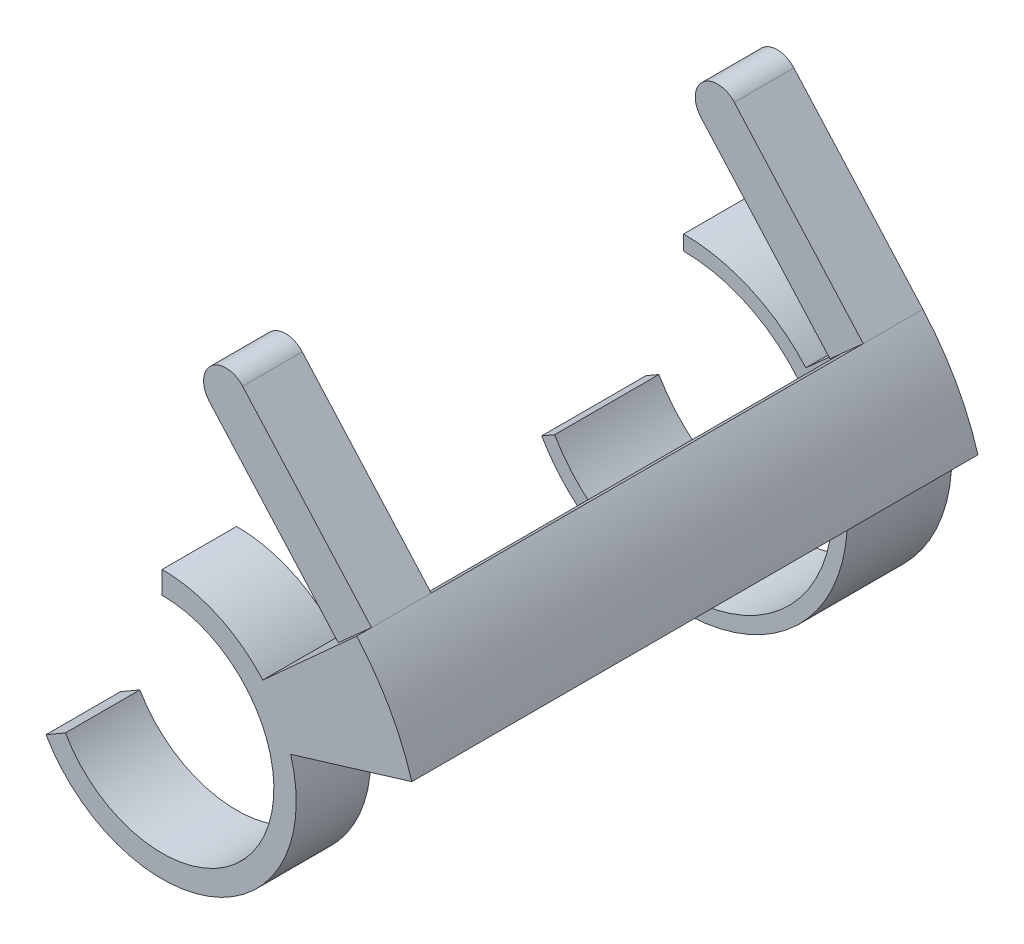
ISO-10303-21;
HEADER;
FILE_DESCRIPTION(('STEP AP214'),'2;1');
FILE_NAME('part.step','',(''),(''),'','','');
FILE_SCHEMA(('AUTOMOTIVE_DESIGN { 1 0 10303 214 1 1 1 1 }'));
ENDSEC;
DATA;
#1=APPLICATION_CONTEXT('core data for automotive mechanical design processes');
#2=APPLICATION_PROTOCOL_DEFINITION('international standard','automotive_design',2000,#1);
#3=PRODUCT_CONTEXT('',#1,'mechanical');
#4=PRODUCT('Part','Part','',(#3));
#5=PRODUCT_RELATED_PRODUCT_CATEGORY('part','',(#4));
#6=PRODUCT_DEFINITION_FORMATION('','',#4);
#7=PRODUCT_DEFINITION_CONTEXT('part definition',#1,'design');
#8=PRODUCT_DEFINITION('design','',#6,#7);
#9=PRODUCT_DEFINITION_SHAPE('','',#8);
#10=(LENGTH_UNIT() NAMED_UNIT(*) SI_UNIT(.MILLI.,.METRE.));
#11=(NAMED_UNIT(*) PLANE_ANGLE_UNIT() SI_UNIT($,.RADIAN.));
#12=(NAMED_UNIT(*) SI_UNIT($,.STERADIAN.) SOLID_ANGLE_UNIT());
#13=UNCERTAINTY_MEASURE_WITH_UNIT(LENGTH_MEASURE(1.E-05),#10,'distance_accuracy_value','');
#14=(GEOMETRIC_REPRESENTATION_CONTEXT(3) GLOBAL_UNCERTAINTY_ASSIGNED_CONTEXT((#13)) GLOBAL_UNIT_ASSIGNED_CONTEXT((#10,
#11,#12)) REPRESENTATION_CONTEXT('',''));
#15=CARTESIAN_POINT('',(0.,0.,0.));
#16=DIRECTION('',(0.,0.,1.));
#17=DIRECTION('',(1.,0.,0.));
#18=AXIS2_PLACEMENT_3D('',#15,#16,#17);
#19=CARTESIAN_POINT('',(10.8188655231511,9.65412599834774,41.));
#20=DIRECTION('',(-0.746128656769038,-0.665801792989499,0.));
#21=DIRECTION('',(0.665801792989499,-0.746128656769038,0.));
#22=AXIS2_PLACEMENT_3D('',#19,#20,#21);
#23=PLANE('',#22);
#24=DIRECTION('',(-0.665801792989499,0.746128656769038,0.));
#25=VECTOR('',#24,1.);
#26=CARTESIAN_POINT('',(10.8188655231511,9.65412599834774,37.));
#27=LINE('',#26,#25);
#28=CARTESIAN_POINT('',(10.8188655231511,9.65412599834774,37.));
#29=VERTEX_POINT('',#28);
#30=CARTESIAN_POINT('',(2.16344221428757,19.3537985363452,37.));
#31=VERTEX_POINT('',#30);
#32=EDGE_CURVE('E107',#29,#31,#27,.T.);
#33=ORIENTED_EDGE('',*,*,#32,.F.);
#34=DIRECTION('',(0.,0.,-1.));
#35=VECTOR('',#34,1.);
#36=CARTESIAN_POINT('',(10.8188655231511,9.65412599834774,41.));
#37=LINE('',#36,#35);
#38=CARTESIAN_POINT('',(10.8188655231511,9.65412599834774,41.));
#39=VERTEX_POINT('',#38);
#40=EDGE_CURVE('E12',#39,#29,#37,.T.);
#41=ORIENTED_EDGE('',*,*,#40,.F.);
#42=DIRECTION('',(-0.665801792989499,0.746128656769038,0.));
#43=VECTOR('',#42,1.);
#44=CARTESIAN_POINT('',(10.8188655231511,9.65412599834774,41.));
#45=LINE('',#44,#43);
#46=CARTESIAN_POINT('',(2.16344221428757,19.3537985363452,41.));
#47=VERTEX_POINT('',#46);
#48=EDGE_CURVE('E101',#39,#47,#45,.T.);
#49=ORIENTED_EDGE('',*,*,#48,.T.);
#50=DIRECTION('',(0.,0.,-1.));
#51=VECTOR('',#50,1.);
#52=CARTESIAN_POINT('',(2.16344221428757,19.3537985363452,41.));
#53=LINE('',#52,#51);
#54=EDGE_CURVE('E46',#47,#31,#53,.T.);
#55=ORIENTED_EDGE('',*,*,#54,.T.);
#56=EDGE_LOOP('',(#33,#41,#49,#55));
#57=FACE_BOUND('',#56,.T.);
#58=ADVANCED_FACE('F43',(#57),#23,.T.);
#59=CARTESIAN_POINT('',(10.8188655231511,9.65412599834774,41.));
#60=DIRECTION('',(0.665801792989499,-0.746128656769038,0.));
#61=DIRECTION('',(0.746128656769038,0.665801792989499,0.));
#62=AXIS2_PLACEMENT_3D('',#59,#60,#61);
#63=PLANE('',#62);
#64=DIRECTION('',(-0.746128656769038,-0.665801792989499,0.));
#65=VECTOR('',#64,1.);
#66=CARTESIAN_POINT('',(10.8188655231511,9.65412599834774,37.));
#67=LINE('',#66,#65);
#68=CARTESIAN_POINT('',(13.0572514934582,11.6515313773162,37.));
#69=VERTEX_POINT('',#68);
#70=EDGE_CURVE('E103',#69,#29,#67,.T.);
#71=ORIENTED_EDGE('',*,*,#70,.F.);
#72=DIRECTION('',(0.,0.,-1.));
#73=VECTOR('',#72,1.);
#74=CARTESIAN_POINT('',(13.0572514934582,11.6515313773162,41.));
#75=LINE('',#74,#73);
#76=CARTESIAN_POINT('',(13.0572514934582,11.6515313773162,41.));
#77=VERTEX_POINT('',#76);
#78=EDGE_CURVE('E52',#77,#69,#75,.T.);
#79=ORIENTED_EDGE('',*,*,#78,.F.);
#80=DIRECTION('',(-0.746128656769038,-0.665801792989499,0.));
#81=VECTOR('',#80,1.);
#82=CARTESIAN_POINT('',(10.8188655231511,9.65412599834774,41.));
#83=LINE('',#82,#81);
#84=EDGE_CURVE('E98',#77,#39,#83,.T.);
#85=ORIENTED_EDGE('',*,*,#84,.T.);
#86=ORIENTED_EDGE('',*,*,#40,.T.);
#87=EDGE_LOOP('',(#71,#79,#85,#86));
#88=FACE_BOUND('',#87,.T.);
#89=ADVANCED_FACE('F117',(#88),#63,.T.);
#90=CARTESIAN_POINT('',(4.40182818459467,21.3512039153137,41.));
#91=DIRECTION('',(0.746128656769037,0.6658017929895,0.));
#92=DIRECTION('',(-0.6658017929895,0.746128656769037,0.));
#93=AXIS2_PLACEMENT_3D('',#90,#91,#92);
#94=PLANE('',#93);
#95=DIRECTION('',(0.6658017929895,-0.746128656769037,0.));
#96=VECTOR('',#95,1.);
#97=CARTESIAN_POINT('',(4.40182818459467,21.3512039153137,37.));
#98=LINE('',#97,#96);
#99=CARTESIAN_POINT('',(4.40182818459467,21.3512039153137,37.));
#100=VERTEX_POINT('',#99);
#101=EDGE_CURVE('E93',#100,#69,#98,.T.);
#102=ORIENTED_EDGE('',*,*,#101,.F.);
#103=DIRECTION('',(0.,0.,-1.));
#104=VECTOR('',#103,1.);
#105=CARTESIAN_POINT('',(4.40182818459467,21.3512039153137,41.));
#106=LINE('',#105,#104);
#107=CARTESIAN_POINT('',(4.40182818459467,21.3512039153137,41.));
#108=VERTEX_POINT('',#107);
#109=EDGE_CURVE('E88',#108,#100,#106,.T.);
#110=ORIENTED_EDGE('',*,*,#109,.F.);
#111=DIRECTION('',(0.6658017929895,-0.746128656769037,0.));
#112=VECTOR('',#111,1.);
#113=CARTESIAN_POINT('',(4.40182818459467,21.3512039153137,41.));
#114=LINE('',#113,#112);
#115=EDGE_CURVE('E91',#108,#77,#114,.T.);
#116=ORIENTED_EDGE('',*,*,#115,.T.);
#117=ORIENTED_EDGE('',*,*,#78,.T.);
#118=EDGE_LOOP('',(#102,#110,#116,#117));
#119=FACE_BOUND('',#118,.T.);
#120=ADVANCED_FACE('F90',(#119),#94,.T.);
#121=CARTESIAN_POINT('',(3.28263519944112,20.3525012258295,41.));
#122=DIRECTION('',(0.,0.,-1.));
#123=DIRECTION('',(-1.,0.,0.));
#124=AXIS2_PLACEMENT_3D('',#121,#122,#123);
#125=CYLINDRICAL_SURFACE('',#124,1.49999999999999);
#126=CARTESIAN_POINT('',(3.28263519944112,20.3525012258295,37.));
#127=DIRECTION('',(0.,0.,-1.));
#128=DIRECTION('',(-1.,0.,0.));
#129=AXIS2_PLACEMENT_3D('',#126,#127,#128);
#130=CIRCLE('',#129,1.49999999999999);
#131=EDGE_CURVE('E110',#31,#100,#130,.T.);
#132=ORIENTED_EDGE('',*,*,#131,.F.);
#133=ORIENTED_EDGE('',*,*,#54,.F.);
#134=CARTESIAN_POINT('',(3.28263519944112,20.3525012258295,41.));
#135=DIRECTION('',(0.,0.,-1.));
#136=DIRECTION('',(-1.,0.,0.));
#137=AXIS2_PLACEMENT_3D('',#134,#135,#136);
#138=CIRCLE('',#137,1.49999999999999);
#139=EDGE_CURVE('E97',#47,#108,#138,.T.);
#140=ORIENTED_EDGE('',*,*,#139,.T.);
#141=ORIENTED_EDGE('',*,*,#109,.T.);
#142=EDGE_LOOP('',(#132,#133,#140,#141));
#143=FACE_BOUND('',#142,.T.);
#144=ADVANCED_FACE('F100',(#143),#125,.T.);
#145=CARTESIAN_POINT('',(3.28263519944112,20.3525012258295,41.));
#146=DIRECTION('',(0.,0.,-1.));
#147=DIRECTION('',(-1.,0.,0.));
#148=AXIS2_PLACEMENT_3D('',#145,#146,#147);
#149=PLANE('',#148);
#150=ORIENTED_EDGE('',*,*,#48,.F.);
#151=ORIENTED_EDGE('',*,*,#84,.F.);
#152=ORIENTED_EDGE('',*,*,#115,.F.);
#153=ORIENTED_EDGE('',*,*,#139,.F.);
#154=EDGE_LOOP('',(#150,#151,#152,#153));
#155=FACE_BOUND('',#154,.T.);
#156=ADVANCED_FACE('F96',(#155),#149,.F.);
#157=CARTESIAN_POINT('',(3.28263519944112,20.3525012258295,37.));
#158=DIRECTION('',(0.,0.,-1.));
#159=DIRECTION('',(-1.,0.,0.));
#160=AXIS2_PLACEMENT_3D('',#157,#158,#159);
#161=PLANE('',#160);
#162=ORIENTED_EDGE('',*,*,#32,.T.);
#163=ORIENTED_EDGE('',*,*,#131,.T.);
#164=ORIENTED_EDGE('',*,*,#101,.T.);
#165=ORIENTED_EDGE('',*,*,#70,.T.);
#166=EDGE_LOOP('',(#162,#163,#164,#165));
#167=FACE_BOUND('',#166,.T.);
#168=ADVANCED_FACE('F116',(#167),#161,.T.);
#169=CLOSED_SHELL('',(#58,#89,#120,#144,#156,#168));
#170=MANIFOLD_SOLID_BREP('B2',#169);
#171=CARTESIAN_POINT('',(8.20741522445942,7.32381972288448,4.));
#172=DIRECTION('',(-0.665801792989498,0.746128656769038,0.));
#173=DIRECTION('',(-0.746128656769038,-0.665801792989499,0.));
#174=AXIS2_PLACEMENT_3D('',#171,#172,#173);
#175=PLANE('',#174);
#176=DIRECTION('',(0.,0.,-1.));
#177=VECTOR('',#176,1.);
#178=CARTESIAN_POINT('',(10.8188655231511,9.65412599834774,8.));
#179=LINE('',#178,#177);
#180=CARTESIAN_POINT('',(10.8188655231511,9.65412599834774,7.));
#181=VERTEX_POINT('',#180);
#182=CARTESIAN_POINT('',(10.8188655231511,9.65412599834774,4.));
#183=VERTEX_POINT('',#182);
#184=EDGE_CURVE('E328',#181,#183,#179,.T.);
#185=ORIENTED_EDGE('',*,*,#184,.T.);
#186=DIRECTION('',(-0.746128656769038,-0.665801792989499,0.));
#187=VECTOR('',#186,1.);
#188=CARTESIAN_POINT('',(8.20741522445942,7.32381972288448,4.));
#189=LINE('',#188,#187);
#190=CARTESIAN_POINT('',(8.20741522445942,7.32381972288448,4.));
#191=VERTEX_POINT('',#190);
#192=EDGE_CURVE('E439',#183,#191,#189,.T.);
#193=ORIENTED_EDGE('',*,*,#192,.T.);
#194=DIRECTION('',(0.,0.,1.));
#195=VECTOR('',#194,1.);
#196=CARTESIAN_POINT('',(8.20741522445942,7.32381972288448,4.));
#197=LINE('',#196,#195);
#198=CARTESIAN_POINT('',(8.20741522445942,7.32381972288448,7.));
#199=VERTEX_POINT('',#198);
#200=EDGE_CURVE('E444',#191,#199,#197,.T.);
#201=ORIENTED_EDGE('',*,*,#200,.T.);
#202=DIRECTION('',(-0.746128656769038,-0.665801792989499,0.));
#203=VECTOR('',#202,1.);
#204=CARTESIAN_POINT('',(8.20741522445942,7.32381972288448,7.));
#205=LINE('',#204,#203);
#206=EDGE_CURVE('E189',#181,#199,#205,.T.);
#207=ORIENTED_EDGE('',*,*,#206,.F.);
#208=EDGE_LOOP('',(#185,#193,#201,#207));
#209=FACE_BOUND('',#208,.T.);
#210=ADVANCED_FACE('F167',(#209),#175,.T.);
#211=CARTESIAN_POINT('',(0.,0.,7.));
#212=DIRECTION('',(0.,0.,1.));
#213=DIRECTION('',(1.,0.,0.));
#214=AXIS2_PLACEMENT_3D('',#211,#212,#213);
#215=PLANE('',#214);
#216=CARTESIAN_POINT('',(0.,0.,7.));
#217=DIRECTION('',(0.,0.,-1.));
#218=DIRECTION('',(1.,0.,0.));
#219=AXIS2_PLACEMENT_3D('',#216,#217,#218);
#220=CIRCLE('',#219,15.5);
#221=CARTESIAN_POINT('',(11.5649941799201,10.3199277913372,7.));
#222=VERTEX_POINT('',#221);
#223=CARTESIAN_POINT('',(14.8428342267596,4.46545318158572,7.));
#224=VERTEX_POINT('',#223);
#225=EDGE_CURVE('E411',#222,#224,#220,.T.);
#226=ORIENTED_EDGE('',*,*,#225,.F.);
#227=EDGE_CURVE('E182',#222,#181,#205,.T.);
#228=ORIENTED_EDGE('',*,*,#227,.T.);
#229=ORIENTED_EDGE('',*,*,#206,.T.);
#230=CARTESIAN_POINT('',(0.,0.,7.));
#231=DIRECTION('',(0.,0.,1.));
#232=DIRECTION('',(1.,0.,0.));
#233=AXIS2_PLACEMENT_3D('',#230,#231,#232);
#234=CIRCLE('',#233,11.);
#235=CARTESIAN_POINT('',(0.,11.,7.));
#236=VERTEX_POINT('',#235);
#237=EDGE_CURVE('E461',#199,#236,#234,.T.);
#238=ORIENTED_EDGE('',*,*,#237,.T.);
#239=DIRECTION('',(0.,-1.,0.));
#240=VECTOR('',#239,1.);
#241=CARTESIAN_POINT('',(0.,10.,7.));
#242=LINE('',#241,#240);
#243=CARTESIAN_POINT('',(0.,10.,7.));
#244=VERTEX_POINT('',#243);
#245=EDGE_CURVE('E465',#236,#244,#242,.T.);
#246=ORIENTED_EDGE('',*,*,#245,.T.);
#247=CARTESIAN_POINT('',(0.,0.,7.));
#248=DIRECTION('',(0.,0.,-1.));
#249=DIRECTION('',(1.,0.,0.));
#250=AXIS2_PLACEMENT_3D('',#247,#248,#249);
#251=CIRCLE('',#250,10.);
#252=CARTESIAN_POINT('',(-8.6602540378444,-4.99999999999998,7.));
#253=VERTEX_POINT('',#252);
#254=EDGE_CURVE('E455',#244,#253,#251,.T.);
#255=ORIENTED_EDGE('',*,*,#254,.T.);
#256=DIRECTION('',(-0.86602540378444,-0.499999999999998,0.));
#257=VECTOR('',#256,1.);
#258=CARTESIAN_POINT('',(-9.52627944162884,-5.49999999999998,7.));
#259=LINE('',#258,#257);
#260=CARTESIAN_POINT('',(-9.52627944162884,-5.49999999999998,7.));
#261=VERTEX_POINT('',#260);
#262=EDGE_CURVE('E458',#253,#261,#259,.T.);
#263=ORIENTED_EDGE('',*,*,#262,.T.);
#264=CARTESIAN_POINT('',(10.5336242899584,3.16903129015761,7.));
#265=VERTEX_POINT('',#264);
#266=EDGE_CURVE('E462',#261,#265,#234,.T.);
#267=ORIENTED_EDGE('',*,*,#266,.T.);
#268=DIRECTION('',(0.957602208178038,0.288093753650691,0.));
#269=VECTOR('',#268,1.);
#270=CARTESIAN_POINT('',(10.5336242899584,3.16903129015761,7.));
#271=LINE('',#270,#269);
#272=EDGE_CURVE('E429',#265,#224,#271,.T.);
#273=ORIENTED_EDGE('',*,*,#272,.T.);
#274=EDGE_LOOP('',(#226,#228,#229,#238,#246,#255,#263,#267,#273));
#275=FACE_BOUND('',#274,.T.);
#276=ADVANCED_FACE('F500',(#275),#215,.T.);
#277=CARTESIAN_POINT('',(0.,0.,7.));
#278=DIRECTION('',(0.,0.,-1.));
#279=DIRECTION('',(-1.,0.,0.));
#280=AXIS2_PLACEMENT_3D('',#277,#278,#279);
#281=CYLINDRICAL_SURFACE('',#280,10.);
#282=CARTESIAN_POINT('',(0.,0.,0.));
#283=DIRECTION('',(0.,0.,-1.));
#284=DIRECTION('',(1.,0.,0.));
#285=AXIS2_PLACEMENT_3D('',#282,#283,#284);
#286=CIRCLE('',#285,10.);
#287=CARTESIAN_POINT('',(0.,10.,0.));
#288=VERTEX_POINT('',#287);
#289=CARTESIAN_POINT('',(-8.6602540378444,-4.99999999999998,0.));
#290=VERTEX_POINT('',#289);
#291=EDGE_CURVE('E446',#288,#290,#286,.T.);
#292=ORIENTED_EDGE('',*,*,#291,.T.);
#293=DIRECTION('',(0.,0.,-1.));
#294=VECTOR('',#293,1.);
#295=CARTESIAN_POINT('',(-8.6602540378444,-4.99999999999998,7.));
#296=LINE('',#295,#294);
#297=EDGE_CURVE('E41',#253,#290,#296,.T.);
#298=ORIENTED_EDGE('',*,*,#297,.F.);
#299=ORIENTED_EDGE('',*,*,#254,.F.);
#300=DIRECTION('',(0.,0.,-1.));
#301=VECTOR('',#300,1.);
#302=CARTESIAN_POINT('',(0.,10.,7.));
#303=LINE('',#302,#301);
#304=EDGE_CURVE('E467',#244,#288,#303,.T.);
#305=ORIENTED_EDGE('',*,*,#304,.T.);
#306=EDGE_LOOP('',(#292,#298,#299,#305));
#307=FACE_BOUND('',#306,.T.);
#308=ADVANCED_FACE('F169',(#307),#281,.F.);
#309=CARTESIAN_POINT('',(-9.52627944162884,-5.49999999999998,7.));
#310=DIRECTION('',(0.499999999999998,-0.86602540378444,0.));
#311=DIRECTION('',(0.86602540378444,0.499999999999998,0.));
#312=AXIS2_PLACEMENT_3D('',#309,#310,#311);
#313=PLANE('',#312);
#314=DIRECTION('',(-0.86602540378444,-0.499999999999998,0.));
#315=VECTOR('',#314,1.);
#316=CARTESIAN_POINT('',(-9.52627944162884,-5.49999999999998,0.));
#317=LINE('',#316,#315);
#318=CARTESIAN_POINT('',(-9.52627944162884,-5.49999999999998,0.));
#319=VERTEX_POINT('',#318);
#320=EDGE_CURVE('E470',#290,#319,#317,.T.);
#321=ORIENTED_EDGE('',*,*,#320,.T.);
#322=DIRECTION('',(0.,0.,-1.));
#323=VECTOR('',#322,1.);
#324=CARTESIAN_POINT('',(-9.52627944162884,-5.49999999999998,7.));
#325=LINE('',#324,#323);
#326=EDGE_CURVE('E175',#261,#319,#325,.T.);
#327=ORIENTED_EDGE('',*,*,#326,.F.);
#328=ORIENTED_EDGE('',*,*,#262,.F.);
#329=ORIENTED_EDGE('',*,*,#297,.T.);
#330=EDGE_LOOP('',(#321,#327,#328,#329));
#331=FACE_BOUND('',#330,.T.);
#332=ADVANCED_FACE('F571',(#331),#313,.F.);
#333=CARTESIAN_POINT('',(0.,0.,7.));
#334=DIRECTION('',(0.,0.,-1.));
#335=DIRECTION('',(-1.,0.,0.));
#336=AXIS2_PLACEMENT_3D('',#333,#334,#335);
#337=CYLINDRICAL_SURFACE('',#336,11.);
#338=ORIENTED_EDGE('',*,*,#237,.F.);
#339=ORIENTED_EDGE('',*,*,#200,.F.);
#340=CARTESIAN_POINT('',(0.,0.,4.));
#341=DIRECTION('',(0.,0.,-1.));
#342=DIRECTION('',(1.,0.,0.));
#343=AXIS2_PLACEMENT_3D('',#340,#341,#342);
#344=CIRCLE('',#343,11.);
#345=CARTESIAN_POINT('',(10.5336242899584,3.16903129015761,4.));
#346=VERTEX_POINT('',#345);
#347=EDGE_CURVE('E430',#191,#346,#344,.T.);
#348=ORIENTED_EDGE('',*,*,#347,.T.);
#349=DIRECTION('',(0.,0.,1.));
#350=VECTOR('',#349,1.);
#351=CARTESIAN_POINT('',(10.5336242899584,3.16903129015761,4.));
#352=LINE('',#351,#350);
#353=EDGE_CURVE('E441',#346,#265,#352,.T.);
#354=ORIENTED_EDGE('',*,*,#353,.T.);
#355=ORIENTED_EDGE('',*,*,#266,.F.);
#356=ORIENTED_EDGE('',*,*,#326,.T.);
#357=CARTESIAN_POINT('',(0.,0.,0.));
#358=DIRECTION('',(0.,0.,1.));
#359=DIRECTION('',(1.,0.,0.));
#360=AXIS2_PLACEMENT_3D('',#357,#358,#359);
#361=CIRCLE('',#360,11.);
#362=CARTESIAN_POINT('',(0.,11.,0.));
#363=VERTEX_POINT('',#362);
#364=EDGE_CURVE('E472',#319,#363,#361,.T.);
#365=ORIENTED_EDGE('',*,*,#364,.T.);
#366=DIRECTION('',(0.,0.,-1.));
#367=VECTOR('',#366,1.);
#368=CARTESIAN_POINT('',(0.,11.,7.));
#369=LINE('',#368,#367);
#370=EDGE_CURVE('E477',#236,#363,#369,.T.);
#371=ORIENTED_EDGE('',*,*,#370,.F.);
#372=EDGE_LOOP('',(#338,#339,#348,#354,#355,#356,#365,#371));
#373=FACE_BOUND('',#372,.T.);
#374=ADVANCED_FACE('F485',(#373),#337,.T.);
#375=CARTESIAN_POINT('',(0.,10.,7.));
#376=DIRECTION('',(1.,0.,0.));
#377=DIRECTION('',(0.,0.,-1.));
#378=AXIS2_PLACEMENT_3D('',#375,#376,#377);
#379=PLANE('',#378);
#380=DIRECTION('',(0.,-1.,0.));
#381=VECTOR('',#380,1.);
#382=CARTESIAN_POINT('',(0.,10.,0.));
#383=LINE('',#382,#381);
#384=EDGE_CURVE('E459',#363,#288,#383,.T.);
#385=ORIENTED_EDGE('',*,*,#384,.T.);
#386=ORIENTED_EDGE('',*,*,#304,.F.);
#387=ORIENTED_EDGE('',*,*,#245,.F.);
#388=ORIENTED_EDGE('',*,*,#370,.T.);
#389=EDGE_LOOP('',(#385,#386,#387,#388));
#390=FACE_BOUND('',#389,.T.);
#391=ADVANCED_FACE('F494',(#390),#379,.F.);
#392=CARTESIAN_POINT('',(0.,0.,0.));
#393=DIRECTION('',(0.,0.,1.));
#394=DIRECTION('',(1.,0.,0.));
#395=AXIS2_PLACEMENT_3D('',#392,#393,#394);
#396=PLANE('',#395);
#397=ORIENTED_EDGE('',*,*,#291,.F.);
#398=ORIENTED_EDGE('',*,*,#384,.F.);
#399=ORIENTED_EDGE('',*,*,#364,.F.);
#400=ORIENTED_EDGE('',*,*,#320,.F.);
#401=EDGE_LOOP('',(#397,#398,#399,#400));
#402=FACE_BOUND('',#401,.T.);
#403=ADVANCED_FACE('F491',(#402),#396,.F.);
#404=DIRECTION('',(-0.746128656769038,-0.665801792989499,0.));
#405=VECTOR('',#404,1.);
#406=CARTESIAN_POINT('',(10.8188655231511,9.65412599834774,8.));
#407=LINE('',#406,#405);
#408=CARTESIAN_POINT('',(13.0572514934582,11.6515313773162,8.));
#409=VERTEX_POINT('',#408);
#410=CARTESIAN_POINT('',(11.5649941799201,10.3199277913372,8.));
#411=VERTEX_POINT('',#410);
#412=EDGE_CURVE('E339',#409,#411,#407,.T.);
#413=ORIENTED_EDGE('',*,*,#412,.T.);
#414=DIRECTION('',(0.,0.,-1.));
#415=VECTOR('',#414,1.);
#416=CARTESIAN_POINT('',(11.5649941799201,10.3199277913372,37.));
#417=LINE('',#416,#415);
#418=CARTESIAN_POINT('',(11.5649941799201,10.3199277913372,37.));
#419=VERTEX_POINT('',#418);
#420=EDGE_CURVE('E426',#419,#411,#417,.T.);
#421=ORIENTED_EDGE('',*,*,#420,.F.);
#422=DIRECTION('',(-0.746128656769038,-0.665801792989499,0.));
#423=VECTOR('',#422,1.);
#424=CARTESIAN_POINT('',(13.0572514934582,11.6515313773162,37.));
#425=LINE('',#424,#423);
#426=CARTESIAN_POINT('',(13.0572514934582,11.6515313773162,37.));
#427=VERTEX_POINT('',#426);
#428=EDGE_CURVE('E412',#427,#419,#425,.T.);
#429=ORIENTED_EDGE('',*,*,#428,.F.);
#430=DIRECTION('',(0.,0.,1.));
#431=VECTOR('',#430,1.);
#432=CARTESIAN_POINT('',(13.0572514934582,11.6515313773162,4.));
#433=LINE('',#432,#431);
#434=EDGE_CURVE('E450',#409,#427,#433,.T.);
#435=ORIENTED_EDGE('',*,*,#434,.F.);
#436=EDGE_LOOP('',(#413,#421,#429,#435));
#437=FACE_BOUND('',#436,.T.);
#438=ADVANCED_FACE('F530',(#437),#175,.T.);
#439=CARTESIAN_POINT('',(0.,0.,4.));
#440=DIRECTION('',(0.,0.,1.));
#441=DIRECTION('',(1.,0.,0.));
#442=AXIS2_PLACEMENT_3D('',#439,#440,#441);
#443=CYLINDRICAL_SURFACE('',#442,17.5);
#444=CARTESIAN_POINT('',(13.0572514934582,11.6515313773162,4.));
#445=VERTEX_POINT('',#444);
#446=EDGE_CURVE('E447',#445,#409,#433,.T.);
#447=ORIENTED_EDGE('',*,*,#446,.T.);
#448=ORIENTED_EDGE('',*,*,#434,.T.);
#449=DIRECTION('',(0.,0.,-1.));
#450=VECTOR('',#449,1.);
#451=CARTESIAN_POINT('',(13.0572514934582,11.6515313773162,42.));
#452=LINE('',#451,#450);
#453=CARTESIAN_POINT('',(13.0572514934582,11.6515313773162,42.));
#454=VERTEX_POINT('',#453);
#455=EDGE_CURVE('E403',#454,#427,#452,.T.);
#456=ORIENTED_EDGE('',*,*,#455,.F.);
#457=CARTESIAN_POINT('',(0.,0.,42.));
#458=DIRECTION('',(0.,0.,1.));
#459=DIRECTION('',(1.,0.,0.));
#460=AXIS2_PLACEMENT_3D('',#457,#458,#459);
#461=CIRCLE('',#460,17.5);
#462=CARTESIAN_POINT('',(16.7580386431157,5.0416406888871,42.));
#463=VERTEX_POINT('',#462);
#464=EDGE_CURVE('E390',#463,#454,#461,.T.);
#465=ORIENTED_EDGE('',*,*,#464,.F.);
#466=DIRECTION('',(0.,0.,-1.));
#467=VECTOR('',#466,1.);
#468=CARTESIAN_POINT('',(16.7580386431157,5.0416406888871,42.));
#469=LINE('',#468,#467);
#470=CARTESIAN_POINT('',(16.7580386431157,5.0416406888871,37.));
#471=VERTEX_POINT('',#470);
#472=EDGE_CURVE('E405',#463,#471,#469,.T.);
#473=ORIENTED_EDGE('',*,*,#472,.T.);
#474=DIRECTION('',(0.,0.,1.));
#475=VECTOR('',#474,1.);
#476=CARTESIAN_POINT('',(16.7580386431157,5.0416406888871,4.));
#477=LINE('',#476,#475);
#478=CARTESIAN_POINT('',(16.7580386431157,5.0416406888871,4.));
#479=VERTEX_POINT('',#478);
#480=EDGE_CURVE('E451',#479,#471,#477,.T.);
#481=ORIENTED_EDGE('',*,*,#480,.F.);
#482=CARTESIAN_POINT('',(0.,0.,4.));
#483=DIRECTION('',(0.,0.,1.));
#484=DIRECTION('',(1.,0.,0.));
#485=AXIS2_PLACEMENT_3D('',#482,#483,#484);
#486=CIRCLE('',#485,17.5);
#487=EDGE_CURVE('E436',#479,#445,#486,.T.);
#488=ORIENTED_EDGE('',*,*,#487,.T.);
#489=EDGE_LOOP('',(#447,#448,#456,#465,#473,#481,#488));
#490=FACE_BOUND('',#489,.T.);
#491=ADVANCED_FACE('F534',(#490),#443,.T.);
#492=CARTESIAN_POINT('',(10.5336242899584,3.16903129015761,4.));
#493=DIRECTION('',(0.288093753650691,-0.957602208178038,0.));
#494=DIRECTION('',(0.957602208178038,0.288093753650691,0.));
#495=AXIS2_PLACEMENT_3D('',#492,#493,#494);
#496=PLANE('',#495);
#497=ORIENTED_EDGE('',*,*,#272,.F.);
#498=ORIENTED_EDGE('',*,*,#353,.F.);
#499=DIRECTION('',(0.957602208178038,0.288093753650691,0.));
#500=VECTOR('',#499,1.);
#501=CARTESIAN_POINT('',(10.5336242899584,3.16903129015761,4.));
#502=LINE('',#501,#500);
#503=EDGE_CURVE('E433',#346,#479,#502,.T.);
#504=ORIENTED_EDGE('',*,*,#503,.T.);
#505=ORIENTED_EDGE('',*,*,#480,.T.);
#506=DIRECTION('',(0.957602208178038,0.288093753650692,0.));
#507=VECTOR('',#506,1.);
#508=CARTESIAN_POINT('',(14.8428342267596,4.46545318158572,37.));
#509=LINE('',#508,#507);
#510=CARTESIAN_POINT('',(14.8428342267596,4.46545318158572,37.));
#511=VERTEX_POINT('',#510);
#512=EDGE_CURVE('E417',#511,#471,#509,.T.);
#513=ORIENTED_EDGE('',*,*,#512,.F.);
#514=DIRECTION('',(0.,0.,-1.));
#515=VECTOR('',#514,1.);
#516=CARTESIAN_POINT('',(14.8428342267596,4.46545318158572,37.));
#517=LINE('',#516,#515);
#518=EDGE_CURVE('E420',#511,#224,#517,.T.);
#519=ORIENTED_EDGE('',*,*,#518,.T.);
#520=EDGE_LOOP('',(#497,#498,#504,#505,#513,#519));
#521=FACE_BOUND('',#520,.T.);
#522=ADVANCED_FACE('F511',(#521),#496,.T.);
#523=CARTESIAN_POINT('',(0.,0.,4.));
#524=DIRECTION('',(0.,0.,1.));
#525=DIRECTION('',(1.,0.,0.));
#526=AXIS2_PLACEMENT_3D('',#523,#524,#525);
#527=PLANE('',#526);
#528=ORIENTED_EDGE('',*,*,#347,.F.);
#529=ORIENTED_EDGE('',*,*,#192,.F.);
#530=DIRECTION('',(-0.665801792989499,0.746128656769038,0.));
#531=VECTOR('',#530,1.);
#532=CARTESIAN_POINT('',(10.8188655231511,9.65412599834774,4.));
#533=LINE('',#532,#531);
#534=CARTESIAN_POINT('',(2.16344221428756,19.3537985363452,4.));
#535=VERTEX_POINT('',#534);
#536=EDGE_CURVE('E344',#183,#535,#533,.T.);
#537=ORIENTED_EDGE('',*,*,#536,.T.);
#538=CARTESIAN_POINT('',(3.28263519944112,20.3525012258295,4.));
#539=DIRECTION('',(0.,0.,-1.));
#540=DIRECTION('',(1.,0.,0.));
#541=AXIS2_PLACEMENT_3D('',#538,#539,#540);
#542=CIRCLE('',#541,1.49999999999999);
#543=CARTESIAN_POINT('',(4.40182818459467,21.3512039153137,4.));
#544=VERTEX_POINT('',#543);
#545=EDGE_CURVE('E351',#535,#544,#542,.T.);
#546=ORIENTED_EDGE('',*,*,#545,.T.);
#547=DIRECTION('',(0.6658017929895,-0.746128656769037,0.));
#548=VECTOR('',#547,1.);
#549=CARTESIAN_POINT('',(13.0572514934582,11.6515313773162,4.));
#550=LINE('',#549,#548);
#551=EDGE_CURVE('E323',#544,#445,#550,.T.);
#552=ORIENTED_EDGE('',*,*,#551,.T.);
#553=ORIENTED_EDGE('',*,*,#487,.F.);
#554=ORIENTED_EDGE('',*,*,#503,.F.);
#555=EDGE_LOOP('',(#528,#529,#537,#546,#552,#553,#554));
#556=FACE_BOUND('',#555,.T.);
#557=ADVANCED_FACE('F508',(#556),#527,.F.);
#558=CARTESIAN_POINT('',(0.,0.,37.));
#559=DIRECTION('',(0.,0.,-1.));
#560=DIRECTION('',(-1.,0.,0.));
#561=AXIS2_PLACEMENT_3D('',#558,#559,#560);
#562=CYLINDRICAL_SURFACE('',#561,15.5);
#563=ORIENTED_EDGE('',*,*,#225,.T.);
#564=ORIENTED_EDGE('',*,*,#518,.F.);
#565=CARTESIAN_POINT('',(0.,0.,37.));
#566=DIRECTION('',(0.,0.,-1.));
#567=DIRECTION('',(1.,0.,0.));
#568=AXIS2_PLACEMENT_3D('',#565,#566,#567);
#569=CIRCLE('',#568,15.5);
#570=CARTESIAN_POINT('',(11.5747174696878,10.3090210736474,37.));
#571=VERTEX_POINT('',#570);
#572=EDGE_CURVE('E414',#571,#511,#569,.T.);
#573=ORIENTED_EDGE('',*,*,#572,.F.);
#574=EDGE_CURVE('E415',#419,#571,#569,.T.);
#575=ORIENTED_EDGE('',*,*,#574,.F.);
#576=ORIENTED_EDGE('',*,*,#420,.T.);
#577=EDGE_CURVE('E425',#411,#222,#417,.T.);
#578=ORIENTED_EDGE('',*,*,#577,.T.);
#579=EDGE_LOOP('',(#563,#564,#573,#575,#576,#578));
#580=FACE_BOUND('',#579,.T.);
#581=ADVANCED_FACE('F514',(#580),#562,.F.);
#582=CARTESIAN_POINT('',(0.,0.,37.));
#583=DIRECTION('',(0.,0.,1.));
#584=DIRECTION('',(1.,0.,0.));
#585=AXIS2_PLACEMENT_3D('',#582,#583,#584);
#586=PLANE('',#585);
#587=DIRECTION('',(-0.741244677862232,-0.671234927235551,0.));
#588=VECTOR('',#587,1.);
#589=CARTESIAN_POINT('',(6.75634477185659,5.94573841703503,37.));
#590=LINE('',#589,#588);
#591=EDGE_CURVE('E391',#427,#571,#590,.T.);
#592=ORIENTED_EDGE('',*,*,#591,.F.);
#593=ORIENTED_EDGE('',*,*,#428,.T.);
#594=ORIENTED_EDGE('',*,*,#574,.T.);
#595=EDGE_LOOP('',(#592,#593,#594));
#596=FACE_BOUND('',#595,.T.);
#597=ADVANCED_FACE('F527',(#596),#586,.T.);
#598=CARTESIAN_POINT('',(0.,0.,37.));
#599=DIRECTION('',(0.,0.,1.));
#600=DIRECTION('',(1.,0.,0.));
#601=AXIS2_PLACEMENT_3D('',#598,#599,#600);
#602=PLANE('',#601);
#603=CARTESIAN_POINT('',(6.75634477185659,5.94573841703503,37.));
#604=VERTEX_POINT('',#603);
#605=EDGE_CURVE('E399',#571,#604,#590,.T.);
#606=ORIENTED_EDGE('',*,*,#605,.F.);
#607=ORIENTED_EDGE('',*,*,#572,.T.);
#608=ORIENTED_EDGE('',*,*,#512,.T.);
#609=DIRECTION('',(0.956684558888273,0.291126527105916,0.));
#610=VECTOR('',#609,1.);
#611=CARTESIAN_POINT('',(8.62614051745867,2.56704105402657,37.));
#612=LINE('',#611,#610);
#613=CARTESIAN_POINT('',(8.62614051745867,2.56704105402657,37.));
#614=VERTEX_POINT('',#613);
#615=EDGE_CURVE('E387',#614,#471,#612,.T.);
#616=ORIENTED_EDGE('',*,*,#615,.F.);
#617=CARTESIAN_POINT('',(0.,0.,37.));
#618=DIRECTION('',(0.,0.,1.));
#619=DIRECTION('',(1.,0.,0.));
#620=AXIS2_PLACEMENT_3D('',#617,#618,#619);
#621=CIRCLE('',#620,9.);
#622=CARTESIAN_POINT('',(-7.79422863405996,-4.49999999999998,37.));
#623=VERTEX_POINT('',#622);
#624=EDGE_CURVE('E368',#623,#614,#621,.T.);
#625=ORIENTED_EDGE('',*,*,#624,.F.);
#626=DIRECTION('',(-0.86602540378444,-0.499999999999998,0.));
#627=VECTOR('',#626,1.);
#628=CARTESIAN_POINT('',(-6.4951905283833,-3.74999999999998,37.));
#629=LINE('',#628,#627);
#630=CARTESIAN_POINT('',(-6.4951905283833,-3.74999999999998,37.));
#631=VERTEX_POINT('',#630);
#632=EDGE_CURVE('E374',#631,#623,#629,.T.);
#633=ORIENTED_EDGE('',*,*,#632,.F.);
#634=CARTESIAN_POINT('',(0.,0.,37.));
#635=DIRECTION('',(0.,0.,-1.));
#636=DIRECTION('',(1.,0.,0.));
#637=AXIS2_PLACEMENT_3D('',#634,#635,#636);
#638=CIRCLE('',#637,7.5);
#639=CARTESIAN_POINT('',(0.,7.5,37.));
#640=VERTEX_POINT('',#639);
#641=EDGE_CURVE('E372',#640,#631,#638,.T.);
#642=ORIENTED_EDGE('',*,*,#641,.F.);
#643=DIRECTION('',(0.,-1.,0.));
#644=VECTOR('',#643,1.);
#645=CARTESIAN_POINT('',(0.,9.,37.));
#646=LINE('',#645,#644);
#647=CARTESIAN_POINT('',(0.,9.,37.));
#648=VERTEX_POINT('',#647);
#649=EDGE_CURVE('E370',#648,#640,#646,.T.);
#650=ORIENTED_EDGE('',*,*,#649,.F.);
#651=EDGE_CURVE('E355',#604,#648,#621,.T.);
#652=ORIENTED_EDGE('',*,*,#651,.F.);
#653=EDGE_LOOP('',(#606,#607,#608,#616,#625,#633,#642,#650,#652));
#654=FACE_BOUND('',#653,.T.);
#655=ADVANCED_FACE('F520',(#654),#602,.F.);
#656=CARTESIAN_POINT('',(8.62614051745867,2.56704105402657,42.));
#657=DIRECTION('',(-0.291126527105916,0.956684558888272,0.));
#658=DIRECTION('',(-0.956684558888273,-0.291126527105916,0.));
#659=AXIS2_PLACEMENT_3D('',#656,#657,#658);
#660=PLANE('',#659);
#661=ORIENTED_EDGE('',*,*,#615,.T.);
#662=ORIENTED_EDGE('',*,*,#472,.F.);
#663=DIRECTION('',(0.956684558888273,0.291126527105916,0.));
#664=VECTOR('',#663,1.);
#665=CARTESIAN_POINT('',(8.62614051745867,2.56704105402657,42.));
#666=LINE('',#665,#664);
#667=CARTESIAN_POINT('',(8.62614051745867,2.56704105402657,42.));
#668=VERTEX_POINT('',#667);
#669=EDGE_CURVE('E388',#668,#463,#666,.T.);
#670=ORIENTED_EDGE('',*,*,#669,.F.);
#671=DIRECTION('',(0.,0.,-1.));
#672=VECTOR('',#671,1.);
#673=CARTESIAN_POINT('',(8.62614051745867,2.56704105402657,42.));
#674=LINE('',#673,#672);
#675=EDGE_CURVE('E408',#668,#614,#674,.T.);
#676=ORIENTED_EDGE('',*,*,#675,.T.);
#677=EDGE_LOOP('',(#661,#662,#670,#676));
#678=FACE_BOUND('',#677,.T.);
#679=ADVANCED_FACE('F628',(#678),#660,.F.);
#680=CARTESIAN_POINT('',(6.75634477185659,5.94573841703503,42.));
#681=DIRECTION('',(0.671234927235551,-0.741244677862232,0.));
#682=DIRECTION('',(0.741244677862232,0.671234927235551,0.));
#683=AXIS2_PLACEMENT_3D('',#680,#681,#682);
#684=PLANE('',#683);
#685=ORIENTED_EDGE('',*,*,#591,.T.);
#686=ORIENTED_EDGE('',*,*,#605,.T.);
#687=DIRECTION('',(0.,0.,-1.));
#688=VECTOR('',#687,1.);
#689=CARTESIAN_POINT('',(6.75634477185659,5.94573841703503,42.));
#690=LINE('',#689,#688);
#691=CARTESIAN_POINT('',(6.75634477185659,5.94573841703503,42.));
#692=VERTEX_POINT('',#691);
#693=EDGE_CURVE('E396',#692,#604,#690,.T.);
#694=ORIENTED_EDGE('',*,*,#693,.F.);
#695=DIRECTION('',(-0.741244677862232,-0.671234927235551,0.));
#696=VECTOR('',#695,1.);
#697=CARTESIAN_POINT('',(6.75634477185659,5.94573841703503,42.));
#698=LINE('',#697,#696);
#699=EDGE_CURVE('E393',#454,#692,#698,.T.);
#700=ORIENTED_EDGE('',*,*,#699,.F.);
#701=ORIENTED_EDGE('',*,*,#455,.T.);
#702=EDGE_LOOP('',(#685,#686,#694,#700,#701));
#703=FACE_BOUND('',#702,.T.);
#704=ADVANCED_FACE('F639',(#703),#684,.F.);
#705=CARTESIAN_POINT('',(0.,0.,42.));
#706=DIRECTION('',(0.,0.,1.));
#707=DIRECTION('',(1.,0.,0.));
#708=AXIS2_PLACEMENT_3D('',#705,#706,#707);
#709=PLANE('',#708);
#710=ORIENTED_EDGE('',*,*,#699,.T.);
#711=CARTESIAN_POINT('',(0.,0.,42.));
#712=DIRECTION('',(0.,0.,1.));
#713=DIRECTION('',(1.,0.,0.));
#714=AXIS2_PLACEMENT_3D('',#711,#712,#713);
#715=CIRCLE('',#714,9.);
#716=CARTESIAN_POINT('',(0.,9.,42.));
#717=VERTEX_POINT('',#716);
#718=EDGE_CURVE('E361',#692,#717,#715,.T.);
#719=ORIENTED_EDGE('',*,*,#718,.T.);
#720=DIRECTION('',(0.,-1.,0.));
#721=VECTOR('',#720,1.);
#722=CARTESIAN_POINT('',(0.,9.,42.));
#723=LINE('',#722,#721);
#724=CARTESIAN_POINT('',(0.,7.5,42.));
#725=VERTEX_POINT('',#724);
#726=EDGE_CURVE('E360',#717,#725,#723,.T.);
#727=ORIENTED_EDGE('',*,*,#726,.T.);
#728=CARTESIAN_POINT('',(0.,0.,42.));
#729=DIRECTION('',(0.,0.,-1.));
#730=DIRECTION('',(1.,0.,0.));
#731=AXIS2_PLACEMENT_3D('',#728,#729,#730);
#732=CIRCLE('',#731,7.5);
#733=CARTESIAN_POINT('',(-6.4951905283833,-3.74999999999998,42.));
#734=VERTEX_POINT('',#733);
#735=EDGE_CURVE('E363',#725,#734,#732,.T.);
#736=ORIENTED_EDGE('',*,*,#735,.T.);
#737=DIRECTION('',(-0.86602540378444,-0.499999999999998,0.));
#738=VECTOR('',#737,1.);
#739=CARTESIAN_POINT('',(-6.4951905283833,-3.74999999999998,42.));
#740=LINE('',#739,#738);
#741=CARTESIAN_POINT('',(-7.79422863405996,-4.49999999999998,42.));
#742=VERTEX_POINT('',#741);
#743=EDGE_CURVE('E365',#734,#742,#740,.T.);
#744=ORIENTED_EDGE('',*,*,#743,.T.);
#745=EDGE_CURVE('E358',#742,#668,#715,.T.);
#746=ORIENTED_EDGE('',*,*,#745,.T.);
#747=ORIENTED_EDGE('',*,*,#669,.T.);
#748=ORIENTED_EDGE('',*,*,#464,.T.);
#749=EDGE_LOOP('',(#710,#719,#727,#736,#744,#746,#747,#748));
#750=FACE_BOUND('',#749,.T.);
#751=ADVANCED_FACE('F647',(#750),#709,.T.);
#752=CARTESIAN_POINT('',(0.,0.,42.));
#753=DIRECTION('',(0.,0.,-1.));
#754=DIRECTION('',(-1.,0.,0.));
#755=AXIS2_PLACEMENT_3D('',#752,#753,#754);
#756=CYLINDRICAL_SURFACE('',#755,9.);
#757=ORIENTED_EDGE('',*,*,#624,.T.);
#758=ORIENTED_EDGE('',*,*,#675,.F.);
#759=ORIENTED_EDGE('',*,*,#745,.F.);
#760=DIRECTION('',(0.,0.,-1.));
#761=VECTOR('',#760,1.);
#762=CARTESIAN_POINT('',(-7.79422863405996,-4.49999999999998,42.));
#763=LINE('',#762,#761);
#764=EDGE_CURVE('E367',#742,#623,#763,.T.);
#765=ORIENTED_EDGE('',*,*,#764,.T.);
#766=EDGE_LOOP('',(#757,#758,#759,#765));
#767=FACE_BOUND('',#766,.T.);
#768=ADVANCED_FACE('F652',(#767),#756,.T.);
#769=ORIENTED_EDGE('',*,*,#718,.F.);
#770=ORIENTED_EDGE('',*,*,#693,.T.);
#771=ORIENTED_EDGE('',*,*,#651,.T.);
#772=DIRECTION('',(0.,0.,-1.));
#773=VECTOR('',#772,1.);
#774=CARTESIAN_POINT('',(0.,9.,42.));
#775=LINE('',#774,#773);
#776=EDGE_CURVE('E384',#717,#648,#775,.T.);
#777=ORIENTED_EDGE('',*,*,#776,.F.);
#778=EDGE_LOOP('',(#769,#770,#771,#777));
#779=FACE_BOUND('',#778,.T.);
#780=ADVANCED_FACE('F663',(#779),#756,.T.);
#781=CARTESIAN_POINT('',(0.,9.,42.));
#782=DIRECTION('',(1.,0.,0.));
#783=DIRECTION('',(0.,0.,-1.));
#784=AXIS2_PLACEMENT_3D('',#781,#782,#783);
#785=PLANE('',#784);
#786=ORIENTED_EDGE('',*,*,#649,.T.);
#787=DIRECTION('',(0.,0.,-1.));
#788=VECTOR('',#787,1.);
#789=CARTESIAN_POINT('',(0.,7.5,42.));
#790=LINE('',#789,#788);
#791=EDGE_CURVE('E381',#725,#640,#790,.T.);
#792=ORIENTED_EDGE('',*,*,#791,.F.);
#793=ORIENTED_EDGE('',*,*,#726,.F.);
#794=ORIENTED_EDGE('',*,*,#776,.T.);
#795=EDGE_LOOP('',(#786,#792,#793,#794));
#796=FACE_BOUND('',#795,.T.);
#797=ADVANCED_FACE('F673',(#796),#785,.F.);
#798=CARTESIAN_POINT('',(0.,0.,42.));
#799=DIRECTION('',(0.,0.,-1.));
#800=DIRECTION('',(-1.,0.,0.));
#801=AXIS2_PLACEMENT_3D('',#798,#799,#800);
#802=CYLINDRICAL_SURFACE('',#801,7.5);
#803=ORIENTED_EDGE('',*,*,#641,.T.);
#804=DIRECTION('',(0.,0.,-1.));
#805=VECTOR('',#804,1.);
#806=CARTESIAN_POINT('',(-6.4951905283833,-3.74999999999998,42.));
#807=LINE('',#806,#805);
#808=EDGE_CURVE('E378',#734,#631,#807,.T.);
#809=ORIENTED_EDGE('',*,*,#808,.F.);
#810=ORIENTED_EDGE('',*,*,#735,.F.);
#811=ORIENTED_EDGE('',*,*,#791,.T.);
#812=EDGE_LOOP('',(#803,#809,#810,#811));
#813=FACE_BOUND('',#812,.T.);
#814=ADVANCED_FACE('F682',(#813),#802,.F.);
#815=CARTESIAN_POINT('',(-6.4951905283833,-3.74999999999998,42.));
#816=DIRECTION('',(0.499999999999998,-0.86602540378444,0.));
#817=DIRECTION('',(0.86602540378444,0.499999999999998,0.));
#818=AXIS2_PLACEMENT_3D('',#815,#816,#817);
#819=PLANE('',#818);
#820=ORIENTED_EDGE('',*,*,#632,.T.);
#821=ORIENTED_EDGE('',*,*,#764,.F.);
#822=ORIENTED_EDGE('',*,*,#743,.F.);
#823=ORIENTED_EDGE('',*,*,#808,.T.);
#824=EDGE_LOOP('',(#820,#821,#822,#823));
#825=FACE_BOUND('',#824,.T.);
#826=ADVANCED_FACE('F691',(#825),#819,.F.);
#827=CARTESIAN_POINT('',(3.28263519944112,20.3525012258295,8.));
#828=DIRECTION('',(0.,0.,-1.));
#829=DIRECTION('',(-1.,0.,0.));
#830=AXIS2_PLACEMENT_3D('',#827,#828,#829);
#831=CYLINDRICAL_SURFACE('',#830,1.49999999999999);
#832=ORIENTED_EDGE('',*,*,#545,.F.);
#833=DIRECTION('',(0.,0.,-1.));
#834=VECTOR('',#833,1.);
#835=CARTESIAN_POINT('',(2.16344221428756,19.3537985363452,8.));
#836=LINE('',#835,#834);
#837=CARTESIAN_POINT('',(2.16344221428756,19.3537985363452,8.));
#838=VERTEX_POINT('',#837);
#839=EDGE_CURVE('E343',#838,#535,#836,.T.);
#840=ORIENTED_EDGE('',*,*,#839,.F.);
#841=CARTESIAN_POINT('',(3.28263519944112,20.3525012258295,8.));
#842=DIRECTION('',(0.,0.,-1.));
#843=DIRECTION('',(1.,0.,0.));
#844=AXIS2_PLACEMENT_3D('',#841,#842,#843);
#845=CIRCLE('',#844,1.49999999999999);
#846=CARTESIAN_POINT('',(4.40182818459467,21.3512039153137,8.));
#847=VERTEX_POINT('',#846);
#848=EDGE_CURVE('E335',#838,#847,#845,.T.);
#849=ORIENTED_EDGE('',*,*,#848,.T.);
#850=DIRECTION('',(0.,0.,-1.));
#851=VECTOR('',#850,1.);
#852=CARTESIAN_POINT('',(4.40182818459467,21.3512039153137,8.));
#853=LINE('',#852,#851);
#854=EDGE_CURVE('E317',#847,#544,#853,.T.);
#855=ORIENTED_EDGE('',*,*,#854,.T.);
#856=EDGE_LOOP('',(#832,#840,#849,#855));
#857=FACE_BOUND('',#856,.T.);
#858=ADVANCED_FACE('F342',(#857),#831,.T.);
#859=CARTESIAN_POINT('',(10.8188655231511,9.65412599834774,8.));
#860=DIRECTION('',(-0.746128656769038,-0.665801792989499,0.));
#861=DIRECTION('',(0.665801792989499,-0.746128656769038,0.));
#862=AXIS2_PLACEMENT_3D('',#859,#860,#861);
#863=PLANE('',#862);
#864=ORIENTED_EDGE('',*,*,#536,.F.);
#865=ORIENTED_EDGE('',*,*,#184,.F.);
#866=CARTESIAN_POINT('',(10.8188655231511,9.65412599834774,8.));
#867=VERTEX_POINT('',#866);
#868=EDGE_CURVE('E356',#867,#181,#179,.T.);
#869=ORIENTED_EDGE('',*,*,#868,.F.);
#870=DIRECTION('',(-0.665801792989499,0.746128656769038,0.));
#871=VECTOR('',#870,1.);
#872=CARTESIAN_POINT('',(10.8188655231511,9.65412599834774,8.));
#873=LINE('',#872,#871);
#874=EDGE_CURVE('E329',#867,#838,#873,.T.);
#875=ORIENTED_EDGE('',*,*,#874,.T.);
#876=ORIENTED_EDGE('',*,*,#839,.T.);
#877=EDGE_LOOP('',(#864,#865,#869,#875,#876));
#878=FACE_BOUND('',#877,.T.);
#879=ADVANCED_FACE('F536',(#878),#863,.T.);
#880=CARTESIAN_POINT('',(10.8188655231511,9.65412599834774,8.));
#881=DIRECTION('',(0.665801792989499,-0.746128656769038,0.));
#882=DIRECTION('',(0.746128656769038,0.665801792989499,0.));
#883=AXIS2_PLACEMENT_3D('',#880,#881,#882);
#884=PLANE('',#883);
#885=ORIENTED_EDGE('',*,*,#868,.T.);
#886=ORIENTED_EDGE('',*,*,#227,.F.);
#887=ORIENTED_EDGE('',*,*,#577,.F.);
#888=EDGE_CURVE('E340',#411,#867,#407,.T.);
#889=ORIENTED_EDGE('',*,*,#888,.T.);
#890=EDGE_LOOP('',(#885,#886,#887,#889));
#891=FACE_BOUND('',#890,.T.);
#892=ADVANCED_FACE('F538',(#891),#884,.T.);
#893=CARTESIAN_POINT('',(13.0572514934582,11.6515313773162,8.));
#894=DIRECTION('',(0.746128656769037,0.6658017929895,0.));
#895=DIRECTION('',(-0.6658017929895,0.746128656769037,0.));
#896=AXIS2_PLACEMENT_3D('',#893,#894,#895);
#897=PLANE('',#896);
#898=ORIENTED_EDGE('',*,*,#551,.F.);
#899=ORIENTED_EDGE('',*,*,#854,.F.);
#900=DIRECTION('',(0.6658017929895,-0.746128656769037,0.));
#901=VECTOR('',#900,1.);
#902=CARTESIAN_POINT('',(13.0572514934582,11.6515313773162,8.));
#903=LINE('',#902,#901);
#904=EDGE_CURVE('E320',#847,#409,#903,.T.);
#905=ORIENTED_EDGE('',*,*,#904,.T.);
#906=ORIENTED_EDGE('',*,*,#446,.F.);
#907=EDGE_LOOP('',(#898,#899,#905,#906));
#908=FACE_BOUND('',#907,.T.);
#909=ADVANCED_FACE('F319',(#908),#897,.T.);
#910=CARTESIAN_POINT('',(3.28263519944112,20.3525012258295,8.));
#911=DIRECTION('',(0.,0.,1.));
#912=DIRECTION('',(1.,0.,0.));
#913=AXIS2_PLACEMENT_3D('',#910,#911,#912);
#914=PLANE('',#913);
#915=ORIENTED_EDGE('',*,*,#848,.F.);
#916=ORIENTED_EDGE('',*,*,#874,.F.);
#917=ORIENTED_EDGE('',*,*,#888,.F.);
#918=ORIENTED_EDGE('',*,*,#412,.F.);
#919=ORIENTED_EDGE('',*,*,#904,.F.);
#920=EDGE_LOOP('',(#915,#916,#917,#918,#919));
#921=FACE_BOUND('',#920,.T.);
#922=ADVANCED_FACE('F333',(#921),#914,.T.);
#923=CLOSED_SHELL('',(#210,#276,#308,#332,#374,#391,#403,#438,#491,#522,#557,#581,#597,#655,
#679,#704,#751,#768,#780,#797,#814,#826,#858,#879,#892,#909,#922));
#924=MANIFOLD_SOLID_BREP('B6',#923);
#925=ADVANCED_BREP_SHAPE_REPRESENTATION('',(#18,#170,#924),#14);
#926=SHAPE_DEFINITION_REPRESENTATION(#9,#925);
ENDSEC;
END-ISO-10303-21;
